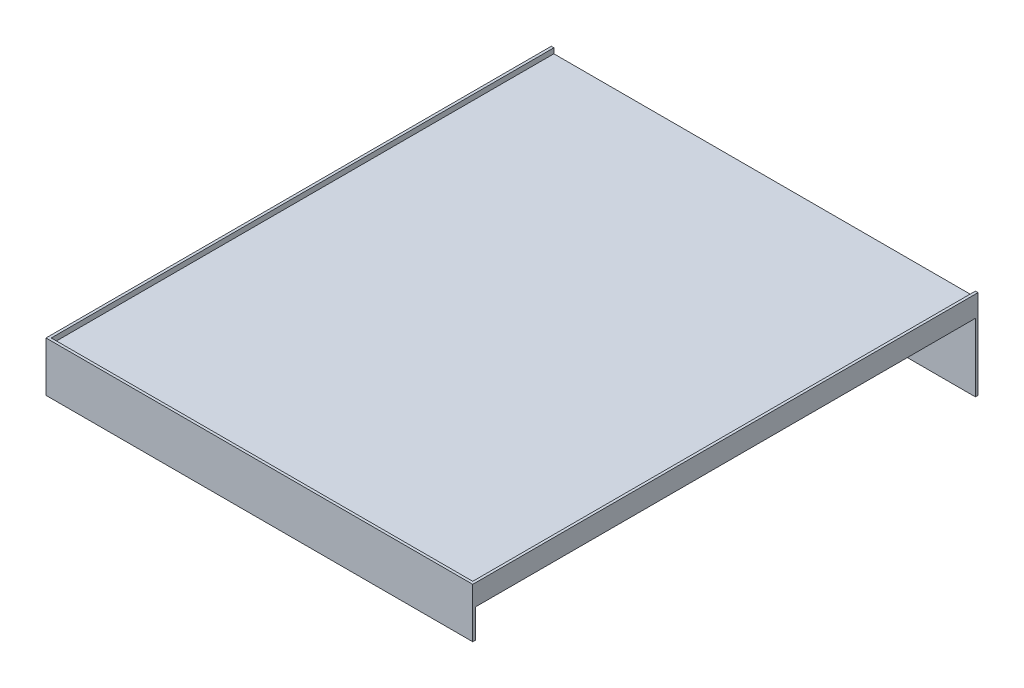
ISO-10303-21;
HEADER;
FILE_DESCRIPTION(('STEP AP214'),'2;1');
FILE_NAME('part.step','',(''),(''),'','','');
FILE_SCHEMA(('AUTOMOTIVE_DESIGN { 1 0 10303 214 1 1 1 1 }'));
ENDSEC;
DATA;
#1=APPLICATION_CONTEXT('core data for automotive mechanical design processes');
#2=APPLICATION_PROTOCOL_DEFINITION('international standard','automotive_design',2000,#1);
#3=PRODUCT_CONTEXT('',#1,'mechanical');
#4=PRODUCT('Part','Part','',(#3));
#5=PRODUCT_RELATED_PRODUCT_CATEGORY('part','',(#4));
#6=PRODUCT_DEFINITION_FORMATION('','',#4);
#7=PRODUCT_DEFINITION_CONTEXT('part definition',#1,'design');
#8=PRODUCT_DEFINITION('design','',#6,#7);
#9=PRODUCT_DEFINITION_SHAPE('','',#8);
#10=(LENGTH_UNIT() NAMED_UNIT(*) SI_UNIT(.MILLI.,.METRE.));
#11=(NAMED_UNIT(*) PLANE_ANGLE_UNIT() SI_UNIT($,.RADIAN.));
#12=(NAMED_UNIT(*) SI_UNIT($,.STERADIAN.) SOLID_ANGLE_UNIT());
#13=UNCERTAINTY_MEASURE_WITH_UNIT(LENGTH_MEASURE(1.E-05),#10,'distance_accuracy_value','');
#14=(GEOMETRIC_REPRESENTATION_CONTEXT(3) GLOBAL_UNCERTAINTY_ASSIGNED_CONTEXT((#13)) GLOBAL_UNIT_ASSIGNED_CONTEXT((#10,
#11,#12)) REPRESENTATION_CONTEXT('',''));
#15=CARTESIAN_POINT('',(0.,0.,0.));
#16=DIRECTION('',(0.,0.,1.));
#17=DIRECTION('',(1.,0.,0.));
#18=AXIS2_PLACEMENT_3D('',#15,#16,#17);
#19=CARTESIAN_POINT('',(407.5,15.,477.5));
#20=DIRECTION('',(0.,1.,0.));
#21=DIRECTION('',(0.,0.,1.));
#22=AXIS2_PLACEMENT_3D('',#19,#20,#21);
#23=PLANE('',#22);
#24=DIRECTION('',(0.,0.,-1.));
#25=VECTOR('',#24,1.);
#26=CARTESIAN_POINT('',(150.,15.,477.5));
#27=LINE('',#26,#25);
#28=CARTESIAN_POINT('',(150.,15.,5.));
#29=VERTEX_POINT('',#28);
#30=CARTESIAN_POINT('',(150.,15.,477.5));
#31=VERTEX_POINT('',#30);
#32=EDGE_CURVE('E272',#29,#31,#27,.F.);
#33=ORIENTED_EDGE('',*,*,#32,.T.);
#34=DIRECTION('',(1.,0.,0.));
#35=VECTOR('',#34,1.);
#36=CARTESIAN_POINT('',(407.5,15.,477.5));
#37=LINE('',#36,#35);
#38=CARTESIAN_POINT('',(-150.,15.,477.5));
#39=VERTEX_POINT('',#38);
#40=EDGE_CURVE('E341',#31,#39,#37,.F.);
#41=ORIENTED_EDGE('',*,*,#40,.T.);
#42=DIRECTION('',(0.,0.,1.));
#43=VECTOR('',#42,1.);
#44=CARTESIAN_POINT('',(-150.,15.,477.5));
#45=LINE('',#44,#43);
#46=CARTESIAN_POINT('',(-150.,15.,5.));
#47=VERTEX_POINT('',#46);
#48=EDGE_CURVE('E281',#39,#47,#45,.F.);
#49=ORIENTED_EDGE('',*,*,#48,.T.);
#50=DIRECTION('',(-1.,0.,0.));
#51=VECTOR('',#50,1.);
#52=CARTESIAN_POINT('',(-407.5,15.,5.));
#53=LINE('',#52,#51);
#54=EDGE_CURVE('E278',#47,#29,#53,.F.);
#55=ORIENTED_EDGE('',*,*,#54,.T.);
#56=EDGE_LOOP('',(#33,#41,#49,#55));
#57=FACE_BOUND('',#56,.T.);
#58=ADVANCED_FACE('F17',(#57),#23,.F.);
#59=CARTESIAN_POINT('',(407.5,15.,477.5));
#60=DIRECTION('',(0.,1.,0.));
#61=DIRECTION('',(0.,0.,1.));
#62=AXIS2_PLACEMENT_3D('',#59,#60,#61);
#63=PLANE('',#62);
#64=DIRECTION('',(-1.,0.,0.));
#65=VECTOR('',#64,1.);
#66=CARTESIAN_POINT('',(-407.5,15.,5.));
#67=LINE('',#66,#65);
#68=CARTESIAN_POINT('',(-402.5,15.,5.));
#69=VERTEX_POINT('',#68);
#70=CARTESIAN_POINT('',(-160.,15.,5.));
#71=VERTEX_POINT('',#70);
#72=EDGE_CURVE('E289',#69,#71,#67,.F.);
#73=ORIENTED_EDGE('',*,*,#72,.T.);
#74=DIRECTION('',(0.,0.,-1.));
#75=VECTOR('',#74,1.);
#76=CARTESIAN_POINT('',(-160.,15.,477.5));
#77=LINE('',#76,#75);
#78=CARTESIAN_POINT('',(-160.,15.,477.5));
#79=VERTEX_POINT('',#78);
#80=EDGE_CURVE('E287',#71,#79,#77,.F.);
#81=ORIENTED_EDGE('',*,*,#80,.T.);
#82=DIRECTION('',(1.,0.,0.));
#83=VECTOR('',#82,1.);
#84=CARTESIAN_POINT('',(407.5,15.,477.5));
#85=LINE('',#84,#83);
#86=CARTESIAN_POINT('',(-402.5,15.,477.5));
#87=VERTEX_POINT('',#86);
#88=EDGE_CURVE('E350',#79,#87,#85,.F.);
#89=ORIENTED_EDGE('',*,*,#88,.T.);
#90=DIRECTION('',(0.,0.,1.));
#91=VECTOR('',#90,1.);
#92=CARTESIAN_POINT('',(-402.5,15.,477.5));
#93=LINE('',#92,#91);
#94=EDGE_CURVE('E295',#87,#69,#93,.F.);
#95=ORIENTED_EDGE('',*,*,#94,.T.);
#96=EDGE_LOOP('',(#73,#81,#89,#95));
#97=FACE_BOUND('',#96,.T.);
#98=ADVANCED_FACE('F687',(#97),#63,.F.);
#99=CARTESIAN_POINT('',(407.5,15.,477.5));
#100=DIRECTION('',(0.,1.,0.));
#101=DIRECTION('',(0.,0.,1.));
#102=AXIS2_PLACEMENT_3D('',#99,#100,#101);
#103=PLANE('',#102);
#104=DIRECTION('',(1.,0.,0.));
#105=VECTOR('',#104,1.);
#106=CARTESIAN_POINT('',(407.5,15.,477.5));
#107=LINE('',#106,#105);
#108=CARTESIAN_POINT('',(402.5,15.,477.5));
#109=VERTEX_POINT('',#108);
#110=CARTESIAN_POINT('',(160.,15.,477.5));
#111=VERTEX_POINT('',#110);
#112=EDGE_CURVE('E360',#109,#111,#107,.F.);
#113=ORIENTED_EDGE('',*,*,#112,.T.);
#114=DIRECTION('',(0.,0.,1.));
#115=VECTOR('',#114,1.);
#116=CARTESIAN_POINT('',(160.,15.,477.5));
#117=LINE('',#116,#115);
#118=CARTESIAN_POINT('',(160.,15.,5.));
#119=VERTEX_POINT('',#118);
#120=EDGE_CURVE('E264',#111,#119,#117,.F.);
#121=ORIENTED_EDGE('',*,*,#120,.T.);
#122=DIRECTION('',(-1.,0.,0.));
#123=VECTOR('',#122,1.);
#124=CARTESIAN_POINT('',(-407.5,15.,5.));
#125=LINE('',#124,#123);
#126=CARTESIAN_POINT('',(402.5,15.,5.));
#127=VERTEX_POINT('',#126);
#128=EDGE_CURVE('E248',#119,#127,#125,.F.);
#129=ORIENTED_EDGE('',*,*,#128,.T.);
#130=DIRECTION('',(0.,0.,-1.));
#131=VECTOR('',#130,1.);
#132=CARTESIAN_POINT('',(402.5,15.,477.5));
#133=LINE('',#132,#131);
#134=EDGE_CURVE('E20',#127,#109,#133,.F.);
#135=ORIENTED_EDGE('',*,*,#134,.T.);
#136=EDGE_LOOP('',(#113,#121,#129,#135));
#137=FACE_BOUND('',#136,.T.);
#138=ADVANCED_FACE('F267',(#137),#103,.F.);
#139=CARTESIAN_POINT('',(402.5,-965.013088915539,477.5));
#140=DIRECTION('',(1.,0.,0.));
#141=DIRECTION('',(0.,0.,-1.));
#142=AXIS2_PLACEMENT_3D('',#139,#140,#141);
#143=PLANE('',#142);
#144=DIRECTION('',(0.,1.,0.));
#145=VECTOR('',#144,1.);
#146=CARTESIAN_POINT('',(402.5,-815.061347384355,5.));
#147=LINE('',#146,#145);
#148=CARTESIAN_POINT('',(402.5,-10.,5.));
#149=VERTEX_POINT('',#148);
#150=EDGE_CURVE('E256',#127,#149,#147,.F.);
#151=ORIENTED_EDGE('',*,*,#150,.T.);
#152=DIRECTION('',(0.,0.,-1.));
#153=VECTOR('',#152,1.);
#154=CARTESIAN_POINT('',(402.5,-10.,-5.));
#155=LINE('',#154,#153);
#156=CARTESIAN_POINT('',(402.5,-10.,477.5));
#157=VERTEX_POINT('',#156);
#158=EDGE_CURVE('E371',#157,#149,#155,.T.);
#159=ORIENTED_EDGE('',*,*,#158,.F.);
#160=DIRECTION('',(0.,1.,0.));
#161=VECTOR('',#160,1.);
#162=CARTESIAN_POINT('',(402.5,0.,477.5));
#163=LINE('',#162,#161);
#164=EDGE_CURVE('E258',#157,#109,#163,.T.);
#165=ORIENTED_EDGE('',*,*,#164,.T.);
#166=ORIENTED_EDGE('',*,*,#134,.F.);
#167=EDGE_LOOP('',(#151,#159,#165,#166));
#168=FACE_BOUND('',#167,.T.);
#169=ADVANCED_FACE('F254',(#168),#143,.F.);
#170=CARTESIAN_POINT('',(-407.5,-815.061347384355,5.));
#171=DIRECTION('',(0.,0.,-1.));
#172=DIRECTION('',(-1.,0.,0.));
#173=AXIS2_PLACEMENT_3D('',#170,#171,#172);
#174=PLANE('',#173);
#175=ORIENTED_EDGE('',*,*,#128,.F.);
#176=DIRECTION('',(0.,1.,0.));
#177=VECTOR('',#176,1.);
#178=CARTESIAN_POINT('',(160.,-955.052354585862,5.));
#179=LINE('',#178,#177);
#180=CARTESIAN_POINT('',(160.,-10.,5.));
#181=VERTEX_POINT('',#180);
#182=EDGE_CURVE('E270',#119,#181,#179,.F.);
#183=ORIENTED_EDGE('',*,*,#182,.T.);
#184=DIRECTION('',(1.,0.,0.));
#185=VECTOR('',#184,1.);
#186=CARTESIAN_POINT('',(-407.5,-10.,5.));
#187=LINE('',#186,#185);
#188=EDGE_CURVE('E263',#149,#181,#187,.F.);
#189=ORIENTED_EDGE('',*,*,#188,.F.);
#190=ORIENTED_EDGE('',*,*,#150,.F.);
#191=EDGE_LOOP('',(#175,#183,#189,#190));
#192=FACE_BOUND('',#191,.T.);
#193=ADVANCED_FACE('F262',(#192),#174,.F.);
#194=CARTESIAN_POINT('',(160.,-955.052354585862,477.5));
#195=DIRECTION('',(-1.,0.,0.));
#196=DIRECTION('',(0.,0.,1.));
#197=AXIS2_PLACEMENT_3D('',#194,#195,#196);
#198=PLANE('',#197);
#199=ORIENTED_EDGE('',*,*,#120,.F.);
#200=DIRECTION('',(0.,1.,0.));
#201=VECTOR('',#200,1.);
#202=CARTESIAN_POINT('',(160.,0.,477.5));
#203=LINE('',#202,#201);
#204=CARTESIAN_POINT('',(160.,-10.,477.5));
#205=VERTEX_POINT('',#204);
#206=EDGE_CURVE('E362',#111,#205,#203,.F.);
#207=ORIENTED_EDGE('',*,*,#206,.T.);
#208=DIRECTION('',(0.,0.,-1.));
#209=VECTOR('',#208,1.);
#210=CARTESIAN_POINT('',(160.,-10.,-5.));
#211=LINE('',#210,#209);
#212=EDGE_CURVE('E374',#181,#205,#211,.F.);
#213=ORIENTED_EDGE('',*,*,#212,.F.);
#214=ORIENTED_EDGE('',*,*,#182,.F.);
#215=EDGE_LOOP('',(#199,#207,#213,#214));
#216=FACE_BOUND('',#215,.T.);
#217=ADVANCED_FACE('F677',(#216),#198,.F.);
#218=CARTESIAN_POINT('',(150.,-955.052354585862,477.5));
#219=DIRECTION('',(1.,0.,0.));
#220=DIRECTION('',(0.,0.,-1.));
#221=AXIS2_PLACEMENT_3D('',#218,#219,#220);
#222=PLANE('',#221);
#223=DIRECTION('',(0.,0.,-1.));
#224=VECTOR('',#223,1.);
#225=CARTESIAN_POINT('',(150.,-10.,-5.));
#226=LINE('',#225,#224);
#227=CARTESIAN_POINT('',(150.,-10.,477.5));
#228=VERTEX_POINT('',#227);
#229=CARTESIAN_POINT('',(150.,-10.,5.));
#230=VERTEX_POINT('',#229);
#231=EDGE_CURVE('E379',#228,#230,#226,.T.);
#232=ORIENTED_EDGE('',*,*,#231,.F.);
#233=DIRECTION('',(0.,1.,0.));
#234=VECTOR('',#233,1.);
#235=CARTESIAN_POINT('',(150.,0.,477.5));
#236=LINE('',#235,#234);
#237=EDGE_CURVE('E365',#228,#31,#236,.T.);
#238=ORIENTED_EDGE('',*,*,#237,.T.);
#239=ORIENTED_EDGE('',*,*,#32,.F.);
#240=DIRECTION('',(0.,1.,0.));
#241=VECTOR('',#240,1.);
#242=CARTESIAN_POINT('',(150.,-815.061347384355,5.));
#243=LINE('',#242,#241);
#244=EDGE_CURVE('E275',#29,#230,#243,.F.);
#245=ORIENTED_EDGE('',*,*,#244,.T.);
#246=EDGE_LOOP('',(#232,#238,#239,#245));
#247=FACE_BOUND('',#246,.T.);
#248=ADVANCED_FACE('F673',(#247),#222,.F.);
#249=CARTESIAN_POINT('',(-407.5,-815.061347384355,5.));
#250=DIRECTION('',(0.,0.,-1.));
#251=DIRECTION('',(-1.,0.,0.));
#252=AXIS2_PLACEMENT_3D('',#249,#250,#251);
#253=PLANE('',#252);
#254=DIRECTION('',(0.,1.,0.));
#255=VECTOR('',#254,1.);
#256=CARTESIAN_POINT('',(-150.,-955.052354585862,5.));
#257=LINE('',#256,#255);
#258=CARTESIAN_POINT('',(-150.,-10.,5.));
#259=VERTEX_POINT('',#258);
#260=EDGE_CURVE('E284',#47,#259,#257,.F.);
#261=ORIENTED_EDGE('',*,*,#260,.T.);
#262=DIRECTION('',(1.,0.,0.));
#263=VECTOR('',#262,1.);
#264=CARTESIAN_POINT('',(-407.5,-10.,5.));
#265=LINE('',#264,#263);
#266=EDGE_CURVE('E381',#230,#259,#265,.F.);
#267=ORIENTED_EDGE('',*,*,#266,.F.);
#268=ORIENTED_EDGE('',*,*,#244,.F.);
#269=ORIENTED_EDGE('',*,*,#54,.F.);
#270=EDGE_LOOP('',(#261,#267,#268,#269));
#271=FACE_BOUND('',#270,.T.);
#272=ADVANCED_FACE('F669',(#271),#253,.F.);
#273=CARTESIAN_POINT('',(-150.,-955.052354585862,477.5));
#274=DIRECTION('',(-1.,0.,0.));
#275=DIRECTION('',(0.,0.,1.));
#276=AXIS2_PLACEMENT_3D('',#273,#274,#275);
#277=PLANE('',#276);
#278=ORIENTED_EDGE('',*,*,#48,.F.);
#279=DIRECTION('',(0.,1.,0.));
#280=VECTOR('',#279,1.);
#281=CARTESIAN_POINT('',(-150.,0.,477.5));
#282=LINE('',#281,#280);
#283=CARTESIAN_POINT('',(-150.,-10.,477.5));
#284=VERTEX_POINT('',#283);
#285=EDGE_CURVE('E344',#39,#284,#282,.F.);
#286=ORIENTED_EDGE('',*,*,#285,.T.);
#287=DIRECTION('',(0.,0.,-1.));
#288=VECTOR('',#287,1.);
#289=CARTESIAN_POINT('',(-150.,-10.,-5.));
#290=LINE('',#289,#288);
#291=EDGE_CURVE('E383',#259,#284,#290,.F.);
#292=ORIENTED_EDGE('',*,*,#291,.F.);
#293=ORIENTED_EDGE('',*,*,#260,.F.);
#294=EDGE_LOOP('',(#278,#286,#292,#293));
#295=FACE_BOUND('',#294,.T.);
#296=ADVANCED_FACE('F665',(#295),#277,.F.);
#297=CARTESIAN_POINT('',(-160.,-955.052354585862,477.5));
#298=DIRECTION('',(1.,0.,0.));
#299=DIRECTION('',(0.,0.,-1.));
#300=AXIS2_PLACEMENT_3D('',#297,#298,#299);
#301=PLANE('',#300);
#302=DIRECTION('',(0.,0.,-1.));
#303=VECTOR('',#302,1.);
#304=CARTESIAN_POINT('',(-160.,-10.,-5.));
#305=LINE('',#304,#303);
#306=CARTESIAN_POINT('',(-160.,-10.,477.5));
#307=VERTEX_POINT('',#306);
#308=CARTESIAN_POINT('',(-160.,-10.,5.));
#309=VERTEX_POINT('',#308);
#310=EDGE_CURVE('E388',#307,#309,#305,.T.);
#311=ORIENTED_EDGE('',*,*,#310,.F.);
#312=DIRECTION('',(0.,1.,0.));
#313=VECTOR('',#312,1.);
#314=CARTESIAN_POINT('',(-160.,0.,477.5));
#315=LINE('',#314,#313);
#316=EDGE_CURVE('E347',#307,#79,#315,.T.);
#317=ORIENTED_EDGE('',*,*,#316,.T.);
#318=ORIENTED_EDGE('',*,*,#80,.F.);
#319=DIRECTION('',(0.,1.,0.));
#320=VECTOR('',#319,1.);
#321=CARTESIAN_POINT('',(-160.,-815.061347384355,5.));
#322=LINE('',#321,#320);
#323=EDGE_CURVE('E292',#71,#309,#322,.F.);
#324=ORIENTED_EDGE('',*,*,#323,.T.);
#325=EDGE_LOOP('',(#311,#317,#318,#324));
#326=FACE_BOUND('',#325,.T.);
#327=ADVANCED_FACE('F661',(#326),#301,.F.);
#328=CARTESIAN_POINT('',(-407.5,-815.061347384355,5.));
#329=DIRECTION('',(0.,0.,-1.));
#330=DIRECTION('',(-1.,0.,0.));
#331=AXIS2_PLACEMENT_3D('',#328,#329,#330);
#332=PLANE('',#331);
#333=DIRECTION('',(1.,0.,0.));
#334=VECTOR('',#333,1.);
#335=CARTESIAN_POINT('',(-407.5,-10.,5.));
#336=LINE('',#335,#334);
#337=CARTESIAN_POINT('',(-402.5,-10.,5.));
#338=VERTEX_POINT('',#337);
#339=EDGE_CURVE('E390',#309,#338,#336,.F.);
#340=ORIENTED_EDGE('',*,*,#339,.F.);
#341=ORIENTED_EDGE('',*,*,#323,.F.);
#342=ORIENTED_EDGE('',*,*,#72,.F.);
#343=DIRECTION('',(0.,1.,0.));
#344=VECTOR('',#343,1.);
#345=CARTESIAN_POINT('',(-402.5,-965.013088915539,5.));
#346=LINE('',#345,#344);
#347=EDGE_CURVE('E298',#69,#338,#346,.F.);
#348=ORIENTED_EDGE('',*,*,#347,.T.);
#349=EDGE_LOOP('',(#340,#341,#342,#348));
#350=FACE_BOUND('',#349,.T.);
#351=ADVANCED_FACE('F657',(#350),#332,.F.);
#352=CARTESIAN_POINT('',(-402.5,-965.013088915539,477.5));
#353=DIRECTION('',(-1.,0.,0.));
#354=DIRECTION('',(0.,0.,1.));
#355=AXIS2_PLACEMENT_3D('',#352,#353,#354);
#356=PLANE('',#355);
#357=ORIENTED_EDGE('',*,*,#347,.F.);
#358=ORIENTED_EDGE('',*,*,#94,.F.);
#359=DIRECTION('',(0.,1.,0.));
#360=VECTOR('',#359,1.);
#361=CARTESIAN_POINT('',(-402.5,0.,477.5));
#362=LINE('',#361,#360);
#363=CARTESIAN_POINT('',(-402.5,-10.,477.5));
#364=VERTEX_POINT('',#363);
#365=EDGE_CURVE('E353',#87,#364,#362,.F.);
#366=ORIENTED_EDGE('',*,*,#365,.T.);
#367=DIRECTION('',(0.,0.,-1.));
#368=VECTOR('',#367,1.);
#369=CARTESIAN_POINT('',(-402.5,-10.,-5.));
#370=LINE('',#369,#368);
#371=EDGE_CURVE('E392',#338,#364,#370,.F.);
#372=ORIENTED_EDGE('',*,*,#371,.F.);
#373=EDGE_LOOP('',(#357,#358,#366,#372));
#374=FACE_BOUND('',#373,.T.);
#375=ADVANCED_FACE('F653',(#374),#356,.F.);
#376=CARTESIAN_POINT('',(-407.5,-815.061347384355,-5.));
#377=DIRECTION('',(0.,0.,1.));
#378=DIRECTION('',(1.,0.,0.));
#379=AXIS2_PLACEMENT_3D('',#376,#377,#378);
#380=PLANE('',#379);
#381=DIRECTION('',(1.,0.,0.));
#382=VECTOR('',#381,1.);
#383=CARTESIAN_POINT('',(407.5,15.,-5.));
#384=LINE('',#383,#382);
#385=CARTESIAN_POINT('',(-402.5,15.,-5.));
#386=VERTEX_POINT('',#385);
#387=CARTESIAN_POINT('',(-160.,15.,-5.));
#388=VERTEX_POINT('',#387);
#389=EDGE_CURVE('E304',#386,#388,#384,.T.);
#390=ORIENTED_EDGE('',*,*,#389,.T.);
#391=DIRECTION('',(0.,1.,0.));
#392=VECTOR('',#391,1.);
#393=CARTESIAN_POINT('',(-160.,-955.052354585862,-5.));
#394=LINE('',#393,#392);
#395=CARTESIAN_POINT('',(-160.,-10.,-5.));
#396=VERTEX_POINT('',#395);
#397=EDGE_CURVE('E312',#388,#396,#394,.F.);
#398=ORIENTED_EDGE('',*,*,#397,.T.);
#399=DIRECTION('',(1.,0.,0.));
#400=VECTOR('',#399,1.);
#401=CARTESIAN_POINT('',(-407.5,-10.,-5.));
#402=LINE('',#401,#400);
#403=CARTESIAN_POINT('',(-402.5,-10.0000000000001,-5.));
#404=VERTEX_POINT('',#403);
#405=EDGE_CURVE('E399',#404,#396,#402,.T.);
#406=ORIENTED_EDGE('',*,*,#405,.F.);
#407=DIRECTION('',(0.,1.,0.));
#408=VECTOR('',#407,1.);
#409=CARTESIAN_POINT('',(-402.5,-965.013088915539,-5.));
#410=LINE('',#409,#408);
#411=EDGE_CURVE('E301',#404,#386,#410,.T.);
#412=ORIENTED_EDGE('',*,*,#411,.T.);
#413=EDGE_LOOP('',(#390,#398,#406,#412));
#414=FACE_BOUND('',#413,.T.);
#415=ADVANCED_FACE('F649',(#414),#380,.F.);
#416=CARTESIAN_POINT('',(-407.5,-815.061347384355,-5.));
#417=DIRECTION('',(0.,0.,1.));
#418=DIRECTION('',(1.,0.,0.));
#419=AXIS2_PLACEMENT_3D('',#416,#417,#418);
#420=PLANE('',#419);
#421=DIRECTION('',(1.,0.,0.));
#422=VECTOR('',#421,1.);
#423=CARTESIAN_POINT('',(-407.5,-10.,-5.));
#424=LINE('',#423,#422);
#425=CARTESIAN_POINT('',(-150.,-10.,-5.));
#426=VERTEX_POINT('',#425);
#427=CARTESIAN_POINT('',(150.,-10.,-5.));
#428=VERTEX_POINT('',#427);
#429=EDGE_CURVE('E406',#426,#428,#424,.T.);
#430=ORIENTED_EDGE('',*,*,#429,.F.);
#431=DIRECTION('',(0.,1.,0.));
#432=VECTOR('',#431,1.);
#433=CARTESIAN_POINT('',(-150.,-955.052354585862,-5.));
#434=LINE('',#433,#432);
#435=CARTESIAN_POINT('',(-150.,15.,-5.));
#436=VERTEX_POINT('',#435);
#437=EDGE_CURVE('E315',#426,#436,#434,.T.);
#438=ORIENTED_EDGE('',*,*,#437,.T.);
#439=DIRECTION('',(1.,0.,0.));
#440=VECTOR('',#439,1.);
#441=CARTESIAN_POINT('',(407.5,15.,-5.));
#442=LINE('',#441,#440);
#443=CARTESIAN_POINT('',(150.,15.,-5.));
#444=VERTEX_POINT('',#443);
#445=EDGE_CURVE('E320',#436,#444,#442,.T.);
#446=ORIENTED_EDGE('',*,*,#445,.T.);
#447=DIRECTION('',(0.,1.,0.));
#448=VECTOR('',#447,1.);
#449=CARTESIAN_POINT('',(150.,-955.052354585862,-5.));
#450=LINE('',#449,#448);
#451=EDGE_CURVE('E325',#444,#428,#450,.F.);
#452=ORIENTED_EDGE('',*,*,#451,.T.);
#453=EDGE_LOOP('',(#430,#438,#446,#452));
#454=FACE_BOUND('',#453,.T.);
#455=ADVANCED_FACE('F645',(#454),#420,.F.);
#456=CARTESIAN_POINT('',(-407.5,-815.061347384355,-5.));
#457=DIRECTION('',(0.,0.,1.));
#458=DIRECTION('',(1.,0.,0.));
#459=AXIS2_PLACEMENT_3D('',#456,#457,#458);
#460=PLANE('',#459);
#461=DIRECTION('',(1.,0.,0.));
#462=VECTOR('',#461,1.);
#463=CARTESIAN_POINT('',(-407.5,-10.,-5.));
#464=LINE('',#463,#462);
#465=CARTESIAN_POINT('',(160.,-10.,-5.));
#466=VERTEX_POINT('',#465);
#467=CARTESIAN_POINT('',(402.5,-10.,-5.));
#468=VERTEX_POINT('',#467);
#469=EDGE_CURVE('E413',#466,#468,#464,.T.);
#470=ORIENTED_EDGE('',*,*,#469,.F.);
#471=DIRECTION('',(0.,1.,0.));
#472=VECTOR('',#471,1.);
#473=CARTESIAN_POINT('',(160.,-955.052354585862,-5.));
#474=LINE('',#473,#472);
#475=CARTESIAN_POINT('',(160.,15.,-5.));
#476=VERTEX_POINT('',#475);
#477=EDGE_CURVE('E328',#466,#476,#474,.T.);
#478=ORIENTED_EDGE('',*,*,#477,.T.);
#479=DIRECTION('',(1.,0.,0.));
#480=VECTOR('',#479,1.);
#481=CARTESIAN_POINT('',(407.5,15.,-5.));
#482=LINE('',#481,#480);
#483=CARTESIAN_POINT('',(402.5,15.,-5.));
#484=VERTEX_POINT('',#483);
#485=EDGE_CURVE('E333',#476,#484,#482,.T.);
#486=ORIENTED_EDGE('',*,*,#485,.T.);
#487=DIRECTION('',(0.,1.,0.));
#488=VECTOR('',#487,1.);
#489=CARTESIAN_POINT('',(402.5,-965.013088915539,-5.));
#490=LINE('',#489,#488);
#491=EDGE_CURVE('E338',#484,#468,#490,.F.);
#492=ORIENTED_EDGE('',*,*,#491,.T.);
#493=EDGE_LOOP('',(#470,#478,#486,#492));
#494=FACE_BOUND('',#493,.T.);
#495=ADVANCED_FACE('F641',(#494),#460,.F.);
#496=CARTESIAN_POINT('',(-402.5,-965.013088915539,477.5));
#497=DIRECTION('',(-1.,0.,0.));
#498=DIRECTION('',(0.,0.,1.));
#499=AXIS2_PLACEMENT_3D('',#496,#497,#498);
#500=PLANE('',#499);
#501=ORIENTED_EDGE('',*,*,#411,.F.);
#502=DIRECTION('',(0.,0.,-1.));
#503=VECTOR('',#502,1.);
#504=CARTESIAN_POINT('',(-402.5,-10.,-5.));
#505=LINE('',#504,#503);
#506=CARTESIAN_POINT('',(-402.5,-10.0000000000001,-477.5));
#507=VERTEX_POINT('',#506);
#508=EDGE_CURVE('E396',#507,#404,#505,.F.);
#509=ORIENTED_EDGE('',*,*,#508,.F.);
#510=DIRECTION('',(0.,1.,0.));
#511=VECTOR('',#510,1.);
#512=CARTESIAN_POINT('',(-402.5,15.,-477.5));
#513=LINE('',#512,#511);
#514=CARTESIAN_POINT('',(-402.5,15.,-477.5));
#515=VERTEX_POINT('',#514);
#516=EDGE_CURVE('E423',#507,#515,#513,.T.);
#517=ORIENTED_EDGE('',*,*,#516,.T.);
#518=DIRECTION('',(0.,0.,1.));
#519=VECTOR('',#518,1.);
#520=CARTESIAN_POINT('',(-402.5,15.,477.5));
#521=LINE('',#520,#519);
#522=EDGE_CURVE('E306',#515,#386,#521,.T.);
#523=ORIENTED_EDGE('',*,*,#522,.T.);
#524=EDGE_LOOP('',(#501,#509,#517,#523));
#525=FACE_BOUND('',#524,.T.);
#526=ADVANCED_FACE('F637',(#525),#500,.F.);
#527=CARTESIAN_POINT('',(407.5,15.,477.5));
#528=DIRECTION('',(0.,1.,0.));
#529=DIRECTION('',(0.,0.,1.));
#530=AXIS2_PLACEMENT_3D('',#527,#528,#529);
#531=PLANE('',#530);
#532=DIRECTION('',(-1.,0.,0.));
#533=VECTOR('',#532,1.);
#534=CARTESIAN_POINT('',(407.5,15.,-477.5));
#535=LINE('',#534,#533);
#536=CARTESIAN_POINT('',(-160.,15.,-477.5));
#537=VERTEX_POINT('',#536);
#538=EDGE_CURVE('E426',#515,#537,#535,.F.);
#539=ORIENTED_EDGE('',*,*,#538,.T.);
#540=DIRECTION('',(0.,0.,-1.));
#541=VECTOR('',#540,1.);
#542=CARTESIAN_POINT('',(-160.,15.,477.5));
#543=LINE('',#542,#541);
#544=EDGE_CURVE('E309',#537,#388,#543,.F.);
#545=ORIENTED_EDGE('',*,*,#544,.T.);
#546=ORIENTED_EDGE('',*,*,#389,.F.);
#547=ORIENTED_EDGE('',*,*,#522,.F.);
#548=EDGE_LOOP('',(#539,#545,#546,#547));
#549=FACE_BOUND('',#548,.T.);
#550=ADVANCED_FACE('F633',(#549),#531,.F.);
#551=CARTESIAN_POINT('',(-160.,-955.052354585862,477.5));
#552=DIRECTION('',(1.,0.,0.));
#553=DIRECTION('',(0.,0.,-1.));
#554=AXIS2_PLACEMENT_3D('',#551,#552,#553);
#555=PLANE('',#554);
#556=ORIENTED_EDGE('',*,*,#544,.F.);
#557=DIRECTION('',(0.,1.,0.));
#558=VECTOR('',#557,1.);
#559=CARTESIAN_POINT('',(-160.,15.,-477.5));
#560=LINE('',#559,#558);
#561=CARTESIAN_POINT('',(-160.,-10.,-477.5));
#562=VERTEX_POINT('',#561);
#563=EDGE_CURVE('E429',#537,#562,#560,.F.);
#564=ORIENTED_EDGE('',*,*,#563,.T.);
#565=DIRECTION('',(0.,0.,-1.));
#566=VECTOR('',#565,1.);
#567=CARTESIAN_POINT('',(-160.,-10.,-5.));
#568=LINE('',#567,#566);
#569=EDGE_CURVE('E401',#396,#562,#568,.T.);
#570=ORIENTED_EDGE('',*,*,#569,.F.);
#571=ORIENTED_EDGE('',*,*,#397,.F.);
#572=EDGE_LOOP('',(#556,#564,#570,#571));
#573=FACE_BOUND('',#572,.T.);
#574=ADVANCED_FACE('F629',(#573),#555,.F.);
#575=CARTESIAN_POINT('',(-150.,-955.052354585862,477.5));
#576=DIRECTION('',(-1.,0.,0.));
#577=DIRECTION('',(0.,0.,1.));
#578=AXIS2_PLACEMENT_3D('',#575,#576,#577);
#579=PLANE('',#578);
#580=DIRECTION('',(0.,0.,-1.));
#581=VECTOR('',#580,1.);
#582=CARTESIAN_POINT('',(-150.,-10.,-5.));
#583=LINE('',#582,#581);
#584=CARTESIAN_POINT('',(-150.,-10.,-477.5));
#585=VERTEX_POINT('',#584);
#586=EDGE_CURVE('E403',#585,#426,#583,.F.);
#587=ORIENTED_EDGE('',*,*,#586,.F.);
#588=DIRECTION('',(0.,1.,0.));
#589=VECTOR('',#588,1.);
#590=CARTESIAN_POINT('',(-150.,15.,-477.5));
#591=LINE('',#590,#589);
#592=CARTESIAN_POINT('',(-150.,15.,-477.5));
#593=VERTEX_POINT('',#592);
#594=EDGE_CURVE('E435',#585,#593,#591,.T.);
#595=ORIENTED_EDGE('',*,*,#594,.T.);
#596=DIRECTION('',(0.,0.,1.));
#597=VECTOR('',#596,1.);
#598=CARTESIAN_POINT('',(-150.,15.,477.5));
#599=LINE('',#598,#597);
#600=EDGE_CURVE('E317',#593,#436,#599,.T.);
#601=ORIENTED_EDGE('',*,*,#600,.T.);
#602=ORIENTED_EDGE('',*,*,#437,.F.);
#603=EDGE_LOOP('',(#587,#595,#601,#602));
#604=FACE_BOUND('',#603,.T.);
#605=ADVANCED_FACE('F625',(#604),#579,.F.);
#606=CARTESIAN_POINT('',(407.5,15.,477.5));
#607=DIRECTION('',(0.,1.,0.));
#608=DIRECTION('',(0.,0.,1.));
#609=AXIS2_PLACEMENT_3D('',#606,#607,#608);
#610=PLANE('',#609);
#611=ORIENTED_EDGE('',*,*,#600,.F.);
#612=DIRECTION('',(-1.,0.,0.));
#613=VECTOR('',#612,1.);
#614=CARTESIAN_POINT('',(407.5,15.,-477.5));
#615=LINE('',#614,#613);
#616=CARTESIAN_POINT('',(150.,15.,-477.5));
#617=VERTEX_POINT('',#616);
#618=EDGE_CURVE('E438',#593,#617,#615,.F.);
#619=ORIENTED_EDGE('',*,*,#618,.T.);
#620=DIRECTION('',(0.,0.,-1.));
#621=VECTOR('',#620,1.);
#622=CARTESIAN_POINT('',(150.,15.,477.5));
#623=LINE('',#622,#621);
#624=EDGE_CURVE('E322',#617,#444,#623,.F.);
#625=ORIENTED_EDGE('',*,*,#624,.T.);
#626=ORIENTED_EDGE('',*,*,#445,.F.);
#627=EDGE_LOOP('',(#611,#619,#625,#626));
#628=FACE_BOUND('',#627,.T.);
#629=ADVANCED_FACE('F621',(#628),#610,.F.);
#630=CARTESIAN_POINT('',(150.,-955.052354585862,477.5));
#631=DIRECTION('',(1.,0.,0.));
#632=DIRECTION('',(0.,0.,-1.));
#633=AXIS2_PLACEMENT_3D('',#630,#631,#632);
#634=PLANE('',#633);
#635=ORIENTED_EDGE('',*,*,#624,.F.);
#636=DIRECTION('',(0.,1.,0.));
#637=VECTOR('',#636,1.);
#638=CARTESIAN_POINT('',(150.,15.,-477.5));
#639=LINE('',#638,#637);
#640=CARTESIAN_POINT('',(150.,-10.,-477.5));
#641=VERTEX_POINT('',#640);
#642=EDGE_CURVE('E441',#617,#641,#639,.F.);
#643=ORIENTED_EDGE('',*,*,#642,.T.);
#644=DIRECTION('',(0.,0.,-1.));
#645=VECTOR('',#644,1.);
#646=CARTESIAN_POINT('',(150.,-10.,-5.));
#647=LINE('',#646,#645);
#648=EDGE_CURVE('E408',#428,#641,#647,.T.);
#649=ORIENTED_EDGE('',*,*,#648,.F.);
#650=ORIENTED_EDGE('',*,*,#451,.F.);
#651=EDGE_LOOP('',(#635,#643,#649,#650));
#652=FACE_BOUND('',#651,.T.);
#653=ADVANCED_FACE('F617',(#652),#634,.F.);
#654=CARTESIAN_POINT('',(160.,-955.052354585862,477.5));
#655=DIRECTION('',(-1.,0.,0.));
#656=DIRECTION('',(0.,0.,1.));
#657=AXIS2_PLACEMENT_3D('',#654,#655,#656);
#658=PLANE('',#657);
#659=DIRECTION('',(0.,0.,-1.));
#660=VECTOR('',#659,1.);
#661=CARTESIAN_POINT('',(160.,-10.,-5.));
#662=LINE('',#661,#660);
#663=CARTESIAN_POINT('',(160.,-10.,-477.5));
#664=VERTEX_POINT('',#663);
#665=EDGE_CURVE('E410',#664,#466,#662,.F.);
#666=ORIENTED_EDGE('',*,*,#665,.F.);
#667=DIRECTION('',(0.,1.,0.));
#668=VECTOR('',#667,1.);
#669=CARTESIAN_POINT('',(160.,15.,-477.5));
#670=LINE('',#669,#668);
#671=CARTESIAN_POINT('',(160.,15.,-477.5));
#672=VERTEX_POINT('',#671);
#673=EDGE_CURVE('E447',#664,#672,#670,.T.);
#674=ORIENTED_EDGE('',*,*,#673,.T.);
#675=DIRECTION('',(0.,0.,1.));
#676=VECTOR('',#675,1.);
#677=CARTESIAN_POINT('',(160.,15.,477.5));
#678=LINE('',#677,#676);
#679=EDGE_CURVE('E330',#672,#476,#678,.T.);
#680=ORIENTED_EDGE('',*,*,#679,.T.);
#681=ORIENTED_EDGE('',*,*,#477,.F.);
#682=EDGE_LOOP('',(#666,#674,#680,#681));
#683=FACE_BOUND('',#682,.T.);
#684=ADVANCED_FACE('F613',(#683),#658,.F.);
#685=CARTESIAN_POINT('',(407.5,15.,477.5));
#686=DIRECTION('',(0.,1.,0.));
#687=DIRECTION('',(0.,0.,1.));
#688=AXIS2_PLACEMENT_3D('',#685,#686,#687);
#689=PLANE('',#688);
#690=ORIENTED_EDGE('',*,*,#485,.F.);
#691=ORIENTED_EDGE('',*,*,#679,.F.);
#692=DIRECTION('',(-1.,0.,0.));
#693=VECTOR('',#692,1.);
#694=CARTESIAN_POINT('',(407.5,15.,-477.5));
#695=LINE('',#694,#693);
#696=CARTESIAN_POINT('',(402.5,15.,-477.5));
#697=VERTEX_POINT('',#696);
#698=EDGE_CURVE('E450',#672,#697,#695,.F.);
#699=ORIENTED_EDGE('',*,*,#698,.T.);
#700=DIRECTION('',(0.,0.,-1.));
#701=VECTOR('',#700,1.);
#702=CARTESIAN_POINT('',(402.5,15.,477.5));
#703=LINE('',#702,#701);
#704=EDGE_CURVE('E335',#697,#484,#703,.F.);
#705=ORIENTED_EDGE('',*,*,#704,.T.);
#706=EDGE_LOOP('',(#690,#691,#699,#705));
#707=FACE_BOUND('',#706,.T.);
#708=ADVANCED_FACE('F609',(#707),#689,.F.);
#709=CARTESIAN_POINT('',(402.5,-965.013088915539,477.5));
#710=DIRECTION('',(1.,0.,0.));
#711=DIRECTION('',(0.,0.,-1.));
#712=AXIS2_PLACEMENT_3D('',#709,#710,#711);
#713=PLANE('',#712);
#714=ORIENTED_EDGE('',*,*,#491,.F.);
#715=ORIENTED_EDGE('',*,*,#704,.F.);
#716=DIRECTION('',(0.,1.,0.));
#717=VECTOR('',#716,1.);
#718=CARTESIAN_POINT('',(402.5,15.,-477.5));
#719=LINE('',#718,#717);
#720=CARTESIAN_POINT('',(402.5,-10.0000000000001,-477.5));
#721=VERTEX_POINT('',#720);
#722=EDGE_CURVE('E453',#697,#721,#719,.F.);
#723=ORIENTED_EDGE('',*,*,#722,.T.);
#724=DIRECTION('',(0.,0.,-1.));
#725=VECTOR('',#724,1.);
#726=CARTESIAN_POINT('',(402.5,-10.,-5.));
#727=LINE('',#726,#725);
#728=EDGE_CURVE('E415',#468,#721,#727,.T.);
#729=ORIENTED_EDGE('',*,*,#728,.F.);
#730=EDGE_LOOP('',(#714,#715,#723,#729));
#731=FACE_BOUND('',#730,.T.);
#732=ADVANCED_FACE('F605',(#731),#713,.F.);
#733=CARTESIAN_POINT('',(-407.5,-65.,477.5));
#734=DIRECTION('',(0.,-1.,0.));
#735=DIRECTION('',(0.,0.,-1.));
#736=AXIS2_PLACEMENT_3D('',#733,#734,#735);
#737=PLANE('',#736);
#738=DIRECTION('',(0.,0.,-1.));
#739=VECTOR('',#738,1.);
#740=CARTESIAN_POINT('',(407.5,-65.,477.5));
#741=LINE('',#740,#739);
#742=CARTESIAN_POINT('',(407.5,-65.,482.5));
#743=VERTEX_POINT('',#742);
#744=CARTESIAN_POINT('',(407.5,-65.,477.5));
#745=VERTEX_POINT('',#744);
#746=EDGE_CURVE('E470',#743,#745,#741,.T.);
#747=ORIENTED_EDGE('',*,*,#746,.F.);
#748=DIRECTION('',(-1.,0.,0.));
#749=VECTOR('',#748,1.);
#750=CARTESIAN_POINT('',(407.5,-65.,482.5));
#751=LINE('',#750,#749);
#752=CARTESIAN_POINT('',(-407.5,-65.,482.5));
#753=VERTEX_POINT('',#752);
#754=EDGE_CURVE('E456',#743,#753,#751,.T.);
#755=ORIENTED_EDGE('',*,*,#754,.T.);
#756=DIRECTION('',(0.,0.,-1.));
#757=VECTOR('',#756,1.);
#758=CARTESIAN_POINT('',(-407.5,-65.,477.5));
#759=LINE('',#758,#757);
#760=CARTESIAN_POINT('',(-407.5,-65.,477.5));
#761=VERTEX_POINT('',#760);
#762=EDGE_CURVE('E481',#753,#761,#759,.T.);
#763=ORIENTED_EDGE('',*,*,#762,.T.);
#764=DIRECTION('',(1.,0.,0.));
#765=VECTOR('',#764,1.);
#766=CARTESIAN_POINT('',(407.5,-65.,477.5));
#767=LINE('',#766,#765);
#768=EDGE_CURVE('E356',#761,#745,#767,.T.);
#769=ORIENTED_EDGE('',*,*,#768,.T.);
#770=EDGE_LOOP('',(#747,#755,#763,#769));
#771=FACE_BOUND('',#770,.T.);
#772=ADVANCED_FACE('F601',(#771),#737,.T.);
#773=CARTESIAN_POINT('',(407.5,0.,477.5));
#774=DIRECTION('',(0.,0.,1.));
#775=DIRECTION('',(1.,0.,0.));
#776=AXIS2_PLACEMENT_3D('',#773,#774,#775);
#777=PLANE('',#776);
#778=DIRECTION('',(1.,0.,0.));
#779=VECTOR('',#778,1.);
#780=CARTESIAN_POINT('',(-407.5,-10.,477.5));
#781=LINE('',#780,#779);
#782=EDGE_CURVE('E376',#205,#228,#781,.F.);
#783=ORIENTED_EDGE('',*,*,#782,.F.);
#784=ORIENTED_EDGE('',*,*,#206,.F.);
#785=ORIENTED_EDGE('',*,*,#112,.F.);
#786=ORIENTED_EDGE('',*,*,#164,.F.);
#787=DIRECTION('',(1.,0.,0.));
#788=VECTOR('',#787,1.);
#789=CARTESIAN_POINT('',(-407.5,-10.,477.5));
#790=LINE('',#789,#788);
#791=CARTESIAN_POINT('',(407.5,-10.,477.5));
#792=VERTEX_POINT('',#791);
#793=EDGE_CURVE('E368',#792,#157,#790,.F.);
#794=ORIENTED_EDGE('',*,*,#793,.F.);
#795=DIRECTION('',(0.,1.,0.));
#796=VECTOR('',#795,1.);
#797=CARTESIAN_POINT('',(407.5,0.,477.5));
#798=LINE('',#797,#796);
#799=EDGE_CURVE('E472',#745,#792,#798,.T.);
#800=ORIENTED_EDGE('',*,*,#799,.F.);
#801=ORIENTED_EDGE('',*,*,#768,.F.);
#802=DIRECTION('',(0.,1.,0.));
#803=VECTOR('',#802,1.);
#804=CARTESIAN_POINT('',(-407.5,0.,477.5));
#805=LINE('',#804,#803);
#806=CARTESIAN_POINT('',(-407.5,-10.,477.5));
#807=VERTEX_POINT('',#806);
#808=EDGE_CURVE('E484',#761,#807,#805,.T.);
#809=ORIENTED_EDGE('',*,*,#808,.T.);
#810=DIRECTION('',(1.,0.,0.));
#811=VECTOR('',#810,1.);
#812=CARTESIAN_POINT('',(-407.5,-10.,477.5));
#813=LINE('',#812,#811);
#814=EDGE_CURVE('E394',#364,#807,#813,.F.);
#815=ORIENTED_EDGE('',*,*,#814,.F.);
#816=ORIENTED_EDGE('',*,*,#365,.F.);
#817=ORIENTED_EDGE('',*,*,#88,.F.);
#818=ORIENTED_EDGE('',*,*,#316,.F.);
#819=DIRECTION('',(1.,0.,0.));
#820=VECTOR('',#819,1.);
#821=CARTESIAN_POINT('',(-407.5,-10.,477.5));
#822=LINE('',#821,#820);
#823=EDGE_CURVE('E385',#284,#307,#822,.F.);
#824=ORIENTED_EDGE('',*,*,#823,.F.);
#825=ORIENTED_EDGE('',*,*,#285,.F.);
#826=ORIENTED_EDGE('',*,*,#40,.F.);
#827=ORIENTED_EDGE('',*,*,#237,.F.);
#828=EDGE_LOOP('',(#783,#784,#785,#786,#794,#800,#801,#809,#815,#816,#817,#818,#824,#825,#826,#827));
#829=FACE_BOUND('',#828,.T.);
#830=ADVANCED_FACE('F597',(#829),#777,.F.);
#831=CARTESIAN_POINT('',(-407.5,-10.,-5.));
#832=DIRECTION('',(0.,-1.,0.));
#833=DIRECTION('',(0.,0.,-1.));
#834=AXIS2_PLACEMENT_3D('',#831,#832,#833);
#835=PLANE('',#834);
#836=ORIENTED_EDGE('',*,*,#728,.T.);
#837=DIRECTION('',(-1.,0.,0.));
#838=VECTOR('',#837,1.);
#839=CARTESIAN_POINT('',(407.5,-10.0000000000002,-477.5));
#840=LINE('',#839,#838);
#841=CARTESIAN_POINT('',(407.5,-10.0000000000001,-477.5));
#842=VERTEX_POINT('',#841);
#843=EDGE_CURVE('E417',#721,#842,#840,.F.);
#844=ORIENTED_EDGE('',*,*,#843,.T.);
#845=DIRECTION('',(0.,0.,-1.));
#846=VECTOR('',#845,1.);
#847=CARTESIAN_POINT('',(407.5,-10.,477.5));
#848=LINE('',#847,#846);
#849=EDGE_CURVE('E461',#792,#842,#848,.T.);
#850=ORIENTED_EDGE('',*,*,#849,.F.);
#851=ORIENTED_EDGE('',*,*,#793,.T.);
#852=ORIENTED_EDGE('',*,*,#158,.T.);
#853=ORIENTED_EDGE('',*,*,#188,.T.);
#854=ORIENTED_EDGE('',*,*,#212,.T.);
#855=ORIENTED_EDGE('',*,*,#782,.T.);
#856=ORIENTED_EDGE('',*,*,#231,.T.);
#857=ORIENTED_EDGE('',*,*,#266,.T.);
#858=ORIENTED_EDGE('',*,*,#291,.T.);
#859=ORIENTED_EDGE('',*,*,#823,.T.);
#860=ORIENTED_EDGE('',*,*,#310,.T.);
#861=ORIENTED_EDGE('',*,*,#339,.T.);
#862=ORIENTED_EDGE('',*,*,#371,.T.);
#863=ORIENTED_EDGE('',*,*,#814,.T.);
#864=DIRECTION('',(0.,0.,-1.));
#865=VECTOR('',#864,1.);
#866=CARTESIAN_POINT('',(-407.5,-10.,477.5));
#867=LINE('',#866,#865);
#868=CARTESIAN_POINT('',(-407.5,-10.0000000000001,-477.5));
#869=VERTEX_POINT('',#868);
#870=EDGE_CURVE('E487',#807,#869,#867,.T.);
#871=ORIENTED_EDGE('',*,*,#870,.T.);
#872=DIRECTION('',(-1.,0.,0.));
#873=VECTOR('',#872,1.);
#874=CARTESIAN_POINT('',(407.5,-10.0000000000002,-477.5));
#875=LINE('',#874,#873);
#876=EDGE_CURVE('E420',#869,#507,#875,.F.);
#877=ORIENTED_EDGE('',*,*,#876,.T.);
#878=ORIENTED_EDGE('',*,*,#508,.T.);
#879=ORIENTED_EDGE('',*,*,#405,.T.);
#880=ORIENTED_EDGE('',*,*,#569,.T.);
#881=DIRECTION('',(-1.,0.,0.));
#882=VECTOR('',#881,1.);
#883=CARTESIAN_POINT('',(407.5,-10.,-477.5));
#884=LINE('',#883,#882);
#885=EDGE_CURVE('E432',#562,#585,#884,.F.);
#886=ORIENTED_EDGE('',*,*,#885,.T.);
#887=ORIENTED_EDGE('',*,*,#586,.T.);
#888=ORIENTED_EDGE('',*,*,#429,.T.);
#889=ORIENTED_EDGE('',*,*,#648,.T.);
#890=DIRECTION('',(-1.,0.,0.));
#891=VECTOR('',#890,1.);
#892=CARTESIAN_POINT('',(407.5,-10.,-477.5));
#893=LINE('',#892,#891);
#894=EDGE_CURVE('E444',#641,#664,#893,.F.);
#895=ORIENTED_EDGE('',*,*,#894,.T.);
#896=ORIENTED_EDGE('',*,*,#665,.T.);
#897=ORIENTED_EDGE('',*,*,#469,.T.);
#898=EDGE_LOOP('',(#836,#844,#850,#851,#852,#853,#854,#855,#856,#857,#858,#859,#860,#861,#862,
#863,#871,#877,#878,#879,#880,#886,#887,#888,#889,#895,#896,#897));
#899=FACE_BOUND('',#898,.T.);
#900=ADVANCED_FACE('F593',(#899),#835,.T.);
#901=CARTESIAN_POINT('',(407.5,15.,-477.5));
#902=DIRECTION('',(0.,0.,-1.));
#903=DIRECTION('',(-1.,0.,0.));
#904=AXIS2_PLACEMENT_3D('',#901,#902,#903);
#905=PLANE('',#904);
#906=ORIENTED_EDGE('',*,*,#698,.F.);
#907=ORIENTED_EDGE('',*,*,#673,.F.);
#908=ORIENTED_EDGE('',*,*,#894,.F.);
#909=ORIENTED_EDGE('',*,*,#642,.F.);
#910=ORIENTED_EDGE('',*,*,#618,.F.);
#911=ORIENTED_EDGE('',*,*,#594,.F.);
#912=ORIENTED_EDGE('',*,*,#885,.F.);
#913=ORIENTED_EDGE('',*,*,#563,.F.);
#914=ORIENTED_EDGE('',*,*,#538,.F.);
#915=ORIENTED_EDGE('',*,*,#516,.F.);
#916=ORIENTED_EDGE('',*,*,#876,.F.);
#917=DIRECTION('',(0.,1.,0.));
#918=VECTOR('',#917,1.);
#919=CARTESIAN_POINT('',(-407.5,0.,-477.5));
#920=LINE('',#919,#918);
#921=CARTESIAN_POINT('',(-407.5,-140.,-477.5));
#922=VERTEX_POINT('',#921);
#923=EDGE_CURVE('E490',#869,#922,#920,.F.);
#924=ORIENTED_EDGE('',*,*,#923,.T.);
#925=DIRECTION('',(1.,0.,0.));
#926=VECTOR('',#925,1.);
#927=CARTESIAN_POINT('',(407.5,-140.,-477.5));
#928=LINE('',#927,#926);
#929=CARTESIAN_POINT('',(407.5,-140.,-477.5));
#930=VERTEX_POINT('',#929);
#931=EDGE_CURVE('E458',#922,#930,#928,.T.);
#932=ORIENTED_EDGE('',*,*,#931,.T.);
#933=DIRECTION('',(0.,1.,0.));
#934=VECTOR('',#933,1.);
#935=CARTESIAN_POINT('',(407.5,0.,-477.5));
#936=LINE('',#935,#934);
#937=EDGE_CURVE('E463',#842,#930,#936,.F.);
#938=ORIENTED_EDGE('',*,*,#937,.F.);
#939=ORIENTED_EDGE('',*,*,#843,.F.);
#940=ORIENTED_EDGE('',*,*,#722,.F.);
#941=EDGE_LOOP('',(#906,#907,#908,#909,#910,#911,#912,#913,#914,#915,#916,#924,#932,#938,#939,#940));
#942=FACE_BOUND('',#941,.T.);
#943=ADVANCED_FACE('F589',(#942),#905,.F.);
#944=CARTESIAN_POINT('',(407.5,0.,482.5));
#945=DIRECTION('',(0.,0.,-1.));
#946=DIRECTION('',(-1.,0.,0.));
#947=AXIS2_PLACEMENT_3D('',#944,#945,#946);
#948=PLANE('',#947);
#949=ORIENTED_EDGE('',*,*,#754,.F.);
#950=DIRECTION('',(0.,1.,0.));
#951=VECTOR('',#950,1.);
#952=CARTESIAN_POINT('',(407.5,0.,482.5));
#953=LINE('',#952,#951);
#954=CARTESIAN_POINT('',(407.5,30.,482.5));
#955=VERTEX_POINT('',#954);
#956=EDGE_CURVE('E467',#955,#743,#953,.F.);
#957=ORIENTED_EDGE('',*,*,#956,.F.);
#958=DIRECTION('',(1.,0.,0.));
#959=VECTOR('',#958,1.);
#960=CARTESIAN_POINT('',(407.5,30.,482.5));
#961=LINE('',#960,#959);
#962=CARTESIAN_POINT('',(-407.5,30.,482.5));
#963=VERTEX_POINT('',#962);
#964=EDGE_CURVE('E493',#955,#963,#961,.F.);
#965=ORIENTED_EDGE('',*,*,#964,.T.);
#966=DIRECTION('',(0.,1.,0.));
#967=VECTOR('',#966,1.);
#968=CARTESIAN_POINT('',(-407.5,0.,482.5));
#969=LINE('',#968,#967);
#970=EDGE_CURVE('E478',#963,#753,#969,.F.);
#971=ORIENTED_EDGE('',*,*,#970,.T.);
#972=EDGE_LOOP('',(#949,#957,#965,#971));
#973=FACE_BOUND('',#972,.T.);
#974=ADVANCED_FACE('F585',(#973),#948,.F.);
#975=CARTESIAN_POINT('',(407.5,-140.,-477.5));
#976=DIRECTION('',(0.,1.,0.));
#977=DIRECTION('',(0.,0.,1.));
#978=AXIS2_PLACEMENT_3D('',#975,#976,#977);
#979=PLANE('',#978);
#980=DIRECTION('',(1.,0.,0.));
#981=VECTOR('',#980,1.);
#982=CARTESIAN_POINT('',(407.5,-140.,-482.5));
#983=LINE('',#982,#981);
#984=CARTESIAN_POINT('',(-407.5,-140.,-482.5));
#985=VERTEX_POINT('',#984);
#986=CARTESIAN_POINT('',(407.5,-140.,-482.5));
#987=VERTEX_POINT('',#986);
#988=EDGE_CURVE('E501',#985,#987,#983,.T.);
#989=ORIENTED_EDGE('',*,*,#988,.T.);
#990=DIRECTION('',(0.,0.,-1.));
#991=VECTOR('',#990,1.);
#992=CARTESIAN_POINT('',(407.5,-140.,477.5));
#993=LINE('',#992,#991);
#994=EDGE_CURVE('E465',#930,#987,#993,.T.);
#995=ORIENTED_EDGE('',*,*,#994,.F.);
#996=ORIENTED_EDGE('',*,*,#931,.F.);
#997=DIRECTION('',(0.,0.,-1.));
#998=VECTOR('',#997,1.);
#999=CARTESIAN_POINT('',(-407.5,-140.,477.5));
#1000=LINE('',#999,#998);
#1001=EDGE_CURVE('E475',#922,#985,#1000,.T.);
#1002=ORIENTED_EDGE('',*,*,#1001,.T.);
#1003=EDGE_LOOP('',(#989,#995,#996,#1002));
#1004=FACE_BOUND('',#1003,.T.);
#1005=ADVANCED_FACE('F581',(#1004),#979,.F.);
#1006=CARTESIAN_POINT('',(407.5,0.,477.5));
#1007=DIRECTION('',(1.,0.,0.));
#1008=DIRECTION('',(0.,0.,-1.));
#1009=AXIS2_PLACEMENT_3D('',#1006,#1007,#1008);
#1010=PLANE('',#1009);
#1011=ORIENTED_EDGE('',*,*,#746,.T.);
#1012=ORIENTED_EDGE('',*,*,#799,.T.);
#1013=ORIENTED_EDGE('',*,*,#849,.T.);
#1014=ORIENTED_EDGE('',*,*,#937,.T.);
#1015=ORIENTED_EDGE('',*,*,#994,.T.);
#1016=DIRECTION('',(0.,1.,0.));
#1017=VECTOR('',#1016,1.);
#1018=CARTESIAN_POINT('',(407.5,20.,-482.5));
#1019=LINE('',#1018,#1017);
#1020=CARTESIAN_POINT('',(407.5,30.,-482.5));
#1021=VERTEX_POINT('',#1020);
#1022=EDGE_CURVE('E504',#987,#1021,#1019,.T.);
#1023=ORIENTED_EDGE('',*,*,#1022,.T.);
#1024=DIRECTION('',(0.,0.,-1.));
#1025=VECTOR('',#1024,1.);
#1026=CARTESIAN_POINT('',(407.5,30.,482.5));
#1027=LINE('',#1026,#1025);
#1028=EDGE_CURVE('E498',#1021,#955,#1027,.F.);
#1029=ORIENTED_EDGE('',*,*,#1028,.T.);
#1030=ORIENTED_EDGE('',*,*,#956,.T.);
#1031=EDGE_LOOP('',(#1011,#1012,#1013,#1014,#1015,#1023,#1029,#1030));
#1032=FACE_BOUND('',#1031,.T.);
#1033=ADVANCED_FACE('F577',(#1032),#1010,.T.);
#1034=CARTESIAN_POINT('',(-407.5,0.,477.5));
#1035=DIRECTION('',(1.,0.,0.));
#1036=DIRECTION('',(0.,0.,-1.));
#1037=AXIS2_PLACEMENT_3D('',#1034,#1035,#1036);
#1038=PLANE('',#1037);
#1039=ORIENTED_EDGE('',*,*,#870,.F.);
#1040=ORIENTED_EDGE('',*,*,#808,.F.);
#1041=ORIENTED_EDGE('',*,*,#762,.F.);
#1042=ORIENTED_EDGE('',*,*,#970,.F.);
#1043=DIRECTION('',(0.,0.,-1.));
#1044=VECTOR('',#1043,1.);
#1045=CARTESIAN_POINT('',(-407.5,30.,482.5));
#1046=LINE('',#1045,#1044);
#1047=CARTESIAN_POINT('',(-407.5,30.,-482.5));
#1048=VERTEX_POINT('',#1047);
#1049=EDGE_CURVE('E496',#963,#1048,#1046,.T.);
#1050=ORIENTED_EDGE('',*,*,#1049,.T.);
#1051=DIRECTION('',(0.,1.,0.));
#1052=VECTOR('',#1051,1.);
#1053=CARTESIAN_POINT('',(-407.5,20.,-482.5));
#1054=LINE('',#1053,#1052);
#1055=EDGE_CURVE('E512',#1048,#985,#1054,.F.);
#1056=ORIENTED_EDGE('',*,*,#1055,.T.);
#1057=ORIENTED_EDGE('',*,*,#1001,.F.);
#1058=ORIENTED_EDGE('',*,*,#923,.F.);
#1059=EDGE_LOOP('',(#1039,#1040,#1041,#1042,#1050,#1056,#1057,#1058));
#1060=FACE_BOUND('',#1059,.T.);
#1061=ADVANCED_FACE('F573',(#1060),#1038,.F.);
#1062=CARTESIAN_POINT('',(407.5,30.,482.5));
#1063=DIRECTION('',(0.,-1.,0.));
#1064=DIRECTION('',(0.,0.,-1.));
#1065=AXIS2_PLACEMENT_3D('',#1062,#1063,#1064);
#1066=PLANE('',#1065);
#1067=DIRECTION('',(1.,0.,0.));
#1068=VECTOR('',#1067,1.);
#1069=CARTESIAN_POINT('',(407.5,30.,-482.5));
#1070=LINE('',#1069,#1068);
#1071=CARTESIAN_POINT('',(402.5,30.,-482.5));
#1072=VERTEX_POINT('',#1071);
#1073=EDGE_CURVE('E507',#1021,#1072,#1070,.F.);
#1074=ORIENTED_EDGE('',*,*,#1073,.T.);
#1075=DIRECTION('',(0.,0.,-1.));
#1076=VECTOR('',#1075,1.);
#1077=CARTESIAN_POINT('',(402.5,30.,-482.5));
#1078=LINE('',#1077,#1076);
#1079=CARTESIAN_POINT('',(402.5,30.,477.5));
#1080=VERTEX_POINT('',#1079);
#1081=EDGE_CURVE('E518',#1072,#1080,#1078,.F.);
#1082=ORIENTED_EDGE('',*,*,#1081,.T.);
#1083=DIRECTION('',(1.,0.,0.));
#1084=VECTOR('',#1083,1.);
#1085=CARTESIAN_POINT('',(402.5,30.,477.5));
#1086=LINE('',#1085,#1084);
#1087=CARTESIAN_POINT('',(-402.5,30.,477.5));
#1088=VERTEX_POINT('',#1087);
#1089=EDGE_CURVE('E523',#1080,#1088,#1086,.F.);
#1090=ORIENTED_EDGE('',*,*,#1089,.T.);
#1091=DIRECTION('',(0.,0.,1.));
#1092=VECTOR('',#1091,1.);
#1093=CARTESIAN_POINT('',(-402.5,30.,477.5));
#1094=LINE('',#1093,#1092);
#1095=CARTESIAN_POINT('',(-402.5,30.,-482.5));
#1096=VERTEX_POINT('',#1095);
#1097=EDGE_CURVE('E526',#1088,#1096,#1094,.F.);
#1098=ORIENTED_EDGE('',*,*,#1097,.T.);
#1099=DIRECTION('',(1.,0.,0.));
#1100=VECTOR('',#1099,1.);
#1101=CARTESIAN_POINT('',(407.5,30.,-482.5));
#1102=LINE('',#1101,#1100);
#1103=EDGE_CURVE('E509',#1096,#1048,#1102,.F.);
#1104=ORIENTED_EDGE('',*,*,#1103,.T.);
#1105=ORIENTED_EDGE('',*,*,#1049,.F.);
#1106=ORIENTED_EDGE('',*,*,#964,.F.);
#1107=ORIENTED_EDGE('',*,*,#1028,.F.);
#1108=EDGE_LOOP('',(#1074,#1082,#1090,#1098,#1104,#1105,#1106,#1107));
#1109=FACE_BOUND('',#1108,.T.);
#1110=ADVANCED_FACE('F570',(#1109),#1066,.F.);
#1111=CARTESIAN_POINT('',(407.5,20.,-482.5));
#1112=DIRECTION('',(0.,0.,1.));
#1113=DIRECTION('',(1.,0.,0.));
#1114=AXIS2_PLACEMENT_3D('',#1111,#1112,#1113);
#1115=PLANE('',#1114);
#1116=ORIENTED_EDGE('',*,*,#1103,.F.);
#1117=DIRECTION('',(0.,1.,0.));
#1118=VECTOR('',#1117,1.);
#1119=CARTESIAN_POINT('',(-402.5,30.,-482.5));
#1120=LINE('',#1119,#1118);
#1121=CARTESIAN_POINT('',(-402.5,20.,-482.5));
#1122=VERTEX_POINT('',#1121);
#1123=EDGE_CURVE('E529',#1096,#1122,#1120,.F.);
#1124=ORIENTED_EDGE('',*,*,#1123,.T.);
#1125=DIRECTION('',(1.,0.,0.));
#1126=VECTOR('',#1125,1.);
#1127=CARTESIAN_POINT('',(407.5,20.,-482.5));
#1128=LINE('',#1127,#1126);
#1129=CARTESIAN_POINT('',(402.5,20.,-482.5));
#1130=VERTEX_POINT('',#1129);
#1131=EDGE_CURVE('E532',#1122,#1130,#1128,.T.);
#1132=ORIENTED_EDGE('',*,*,#1131,.T.);
#1133=DIRECTION('',(0.,1.,0.));
#1134=VECTOR('',#1133,1.);
#1135=CARTESIAN_POINT('',(402.5,30.,-482.5));
#1136=LINE('',#1135,#1134);
#1137=EDGE_CURVE('E515',#1130,#1072,#1136,.T.);
#1138=ORIENTED_EDGE('',*,*,#1137,.T.);
#1139=ORIENTED_EDGE('',*,*,#1073,.F.);
#1140=ORIENTED_EDGE('',*,*,#1022,.F.);
#1141=ORIENTED_EDGE('',*,*,#988,.F.);
#1142=ORIENTED_EDGE('',*,*,#1055,.F.);
#1143=EDGE_LOOP('',(#1116,#1124,#1132,#1138,#1139,#1140,#1141,#1142));
#1144=FACE_BOUND('',#1143,.T.);
#1145=ADVANCED_FACE('F551',(#1144),#1115,.F.);
#1146=CARTESIAN_POINT('',(402.5,30.,-482.5));
#1147=DIRECTION('',(1.,0.,0.));
#1148=DIRECTION('',(0.,0.,-1.));
#1149=AXIS2_PLACEMENT_3D('',#1146,#1147,#1148);
#1150=PLANE('',#1149);
#1151=DIRECTION('',(0.,1.,0.));
#1152=VECTOR('',#1151,1.);
#1153=CARTESIAN_POINT('',(402.5,30.,477.5));
#1154=LINE('',#1153,#1152);
#1155=CARTESIAN_POINT('',(402.5,20.,477.5));
#1156=VERTEX_POINT('',#1155);
#1157=EDGE_CURVE('E520',#1156,#1080,#1154,.T.);
#1158=ORIENTED_EDGE('',*,*,#1157,.T.);
#1159=ORIENTED_EDGE('',*,*,#1081,.F.);
#1160=ORIENTED_EDGE('',*,*,#1137,.F.);
#1161=DIRECTION('',(0.,0.,-1.));
#1162=VECTOR('',#1161,1.);
#1163=CARTESIAN_POINT('',(402.5,20.,482.5));
#1164=LINE('',#1163,#1162);
#1165=EDGE_CURVE('E535',#1130,#1156,#1164,.F.);
#1166=ORIENTED_EDGE('',*,*,#1165,.T.);
#1167=EDGE_LOOP('',(#1158,#1159,#1160,#1166));
#1168=FACE_BOUND('',#1167,.T.);
#1169=ADVANCED_FACE('F547',(#1168),#1150,.F.);
#1170=CARTESIAN_POINT('',(402.5,30.,477.5));
#1171=DIRECTION('',(0.,0.,1.));
#1172=DIRECTION('',(1.,0.,0.));
#1173=AXIS2_PLACEMENT_3D('',#1170,#1171,#1172);
#1174=PLANE('',#1173);
#1175=DIRECTION('',(0.,1.,0.));
#1176=VECTOR('',#1175,1.);
#1177=CARTESIAN_POINT('',(-402.5,30.,477.5));
#1178=LINE('',#1177,#1176);
#1179=CARTESIAN_POINT('',(-402.5,20.,477.5));
#1180=VERTEX_POINT('',#1179);
#1181=EDGE_CURVE('E34',#1180,#1088,#1178,.T.);
#1182=ORIENTED_EDGE('',*,*,#1181,.T.);
#1183=ORIENTED_EDGE('',*,*,#1089,.F.);
#1184=ORIENTED_EDGE('',*,*,#1157,.F.);
#1185=DIRECTION('',(1.,0.,0.));
#1186=VECTOR('',#1185,1.);
#1187=CARTESIAN_POINT('',(407.5,20.,477.5));
#1188=LINE('',#1187,#1186);
#1189=EDGE_CURVE('E26',#1156,#1180,#1188,.F.);
#1190=ORIENTED_EDGE('',*,*,#1189,.T.);
#1191=EDGE_LOOP('',(#1182,#1183,#1184,#1190));
#1192=FACE_BOUND('',#1191,.T.);
#1193=ADVANCED_FACE('F541',(#1192),#1174,.F.);
#1194=CARTESIAN_POINT('',(-402.5,30.,477.5));
#1195=DIRECTION('',(-1.,0.,0.));
#1196=DIRECTION('',(0.,0.,1.));
#1197=AXIS2_PLACEMENT_3D('',#1194,#1195,#1196);
#1198=PLANE('',#1197);
#1199=ORIENTED_EDGE('',*,*,#1123,.F.);
#1200=ORIENTED_EDGE('',*,*,#1097,.F.);
#1201=ORIENTED_EDGE('',*,*,#1181,.F.);
#1202=DIRECTION('',(0.,0.,-1.));
#1203=VECTOR('',#1202,1.);
#1204=CARTESIAN_POINT('',(-402.5,20.,482.5));
#1205=LINE('',#1204,#1203);
#1206=EDGE_CURVE('E11',#1180,#1122,#1205,.T.);
#1207=ORIENTED_EDGE('',*,*,#1206,.T.);
#1208=EDGE_LOOP('',(#1199,#1200,#1201,#1207));
#1209=FACE_BOUND('',#1208,.T.);
#1210=ADVANCED_FACE('F555',(#1209),#1198,.F.);
#1211=CARTESIAN_POINT('',(407.5,20.,482.5));
#1212=DIRECTION('',(0.,-1.,0.));
#1213=DIRECTION('',(0.,0.,-1.));
#1214=AXIS2_PLACEMENT_3D('',#1211,#1212,#1213);
#1215=PLANE('',#1214);
#1216=ORIENTED_EDGE('',*,*,#1189,.F.);
#1217=ORIENTED_EDGE('',*,*,#1165,.F.);
#1218=ORIENTED_EDGE('',*,*,#1131,.F.);
#1219=ORIENTED_EDGE('',*,*,#1206,.F.);
#1220=EDGE_LOOP('',(#1216,#1217,#1218,#1219));
#1221=FACE_BOUND('',#1220,.T.);
#1222=ADVANCED_FACE('F545',(#1221),#1215,.F.);
#1223=CLOSED_SHELL('',(#58,#98,#138,#169,#193,#217,#248,#272,#296,#327,#351,#375,#415,#455,#495,
#526,#550,#574,#605,#629,#653,#684,#708,#732,#772,#830,#900,#943,#974,#1005,#1033,#1061,#1110,
#1145,#1169,#1193,#1210,#1222));
#1224=MANIFOLD_SOLID_BREP('B1',#1223);
#1225=ADVANCED_BREP_SHAPE_REPRESENTATION('',(#18,#1224),#14);
#1226=SHAPE_DEFINITION_REPRESENTATION(#9,#1225);
ENDSEC;
END-ISO-10303-21;
